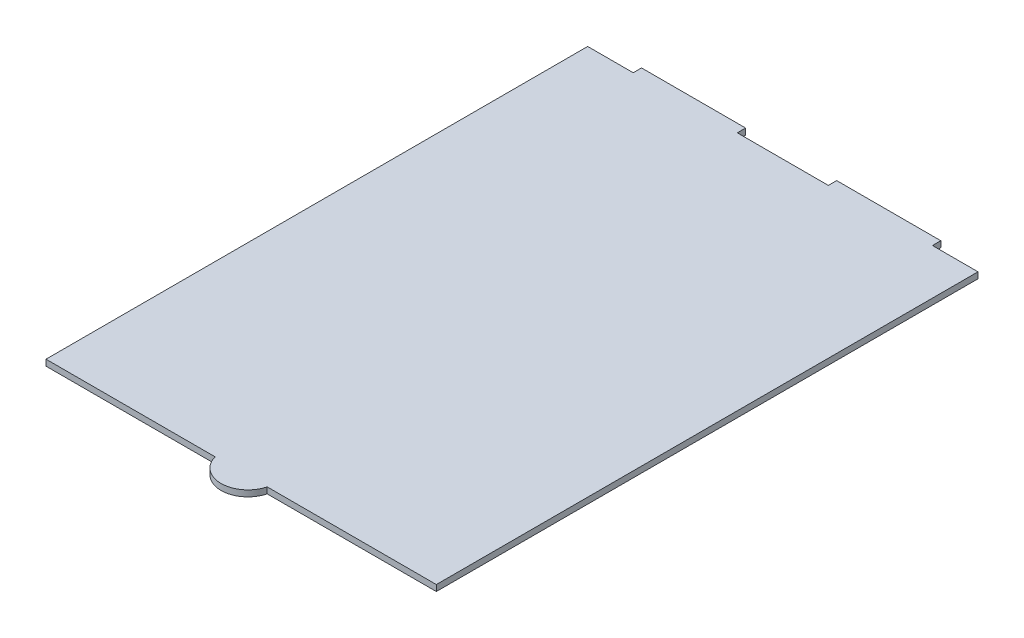
ISO-10303-21;
HEADER;
FILE_DESCRIPTION(('STEP AP214'),'2;1');
FILE_NAME('part.step','',(''),(''),'','','');
FILE_SCHEMA(('AUTOMOTIVE_DESIGN { 1 0 10303 214 1 1 1 1 }'));
ENDSEC;
DATA;
#1=APPLICATION_CONTEXT('core data for automotive mechanical design processes');
#2=APPLICATION_PROTOCOL_DEFINITION('international standard','automotive_design',2000,#1);
#3=PRODUCT_CONTEXT('',#1,'mechanical');
#4=PRODUCT('Part','Part','',(#3));
#5=PRODUCT_RELATED_PRODUCT_CATEGORY('part','',(#4));
#6=PRODUCT_DEFINITION_FORMATION('','',#4);
#7=PRODUCT_DEFINITION_CONTEXT('part definition',#1,'design');
#8=PRODUCT_DEFINITION('design','',#6,#7);
#9=PRODUCT_DEFINITION_SHAPE('','',#8);
#10=(LENGTH_UNIT() NAMED_UNIT(*) SI_UNIT(.MILLI.,.METRE.));
#11=(NAMED_UNIT(*) PLANE_ANGLE_UNIT() SI_UNIT($,.RADIAN.));
#12=(NAMED_UNIT(*) SI_UNIT($,.STERADIAN.) SOLID_ANGLE_UNIT());
#13=UNCERTAINTY_MEASURE_WITH_UNIT(LENGTH_MEASURE(1.E-05),#10,'distance_accuracy_value','');
#14=(GEOMETRIC_REPRESENTATION_CONTEXT(3) GLOBAL_UNCERTAINTY_ASSIGNED_CONTEXT((#13)) GLOBAL_UNIT_ASSIGNED_CONTEXT((#10,
#11,#12)) REPRESENTATION_CONTEXT('',''));
#15=CARTESIAN_POINT('',(0.,0.,0.));
#16=DIRECTION('',(0.,0.,1.));
#17=DIRECTION('',(1.,0.,0.));
#18=AXIS2_PLACEMENT_3D('',#15,#16,#17);
#19=CARTESIAN_POINT('',(1266.82177177283,6.7818,384.048));
#20=DIRECTION('',(0.,0.,1.));
#21=DIRECTION('',(1.,0.,0.));
#22=AXIS2_PLACEMENT_3D('',#19,#20,#21);
#23=PLANE('',#22);
#24=DIRECTION('',(-1.,0.,0.));
#25=VECTOR('',#24,1.);
#26=CARTESIAN_POINT('',(1266.82177177283,3.81,384.048));
#27=LINE('',#26,#25);
#28=CARTESIAN_POINT('',(1289.05,3.81,384.048));
#29=VERTEX_POINT('',#28);
#30=CARTESIAN_POINT('',(1266.82177177283,3.81,384.048));
#31=VERTEX_POINT('',#30);
#32=EDGE_CURVE('E167',#29,#31,#27,.T.);
#33=ORIENTED_EDGE('',*,*,#32,.T.);
#34=DIRECTION('',(0.,-1.,0.));
#35=VECTOR('',#34,1.);
#36=CARTESIAN_POINT('',(1266.82177177283,6.7818,384.048));
#37=LINE('',#36,#35);
#38=CARTESIAN_POINT('',(1266.82177177283,6.7818,384.048));
#39=VERTEX_POINT('',#38);
#40=EDGE_CURVE('E11',#39,#31,#37,.T.);
#41=ORIENTED_EDGE('',*,*,#40,.F.);
#42=DIRECTION('',(-1.,0.,0.));
#43=VECTOR('',#42,1.);
#44=CARTESIAN_POINT('',(1266.82177177283,6.7818,384.048));
#45=LINE('',#44,#43);
#46=CARTESIAN_POINT('',(1289.05,6.7818,384.048));
#47=VERTEX_POINT('',#46);
#48=EDGE_CURVE('E193',#47,#39,#45,.T.);
#49=ORIENTED_EDGE('',*,*,#48,.F.);
#50=DIRECTION('',(0.,-1.,0.));
#51=VECTOR('',#50,1.);
#52=CARTESIAN_POINT('',(1289.05,6.7818,384.048));
#53=LINE('',#52,#51);
#54=EDGE_CURVE('E163',#47,#29,#53,.T.);
#55=ORIENTED_EDGE('',*,*,#54,.T.);
#56=EDGE_LOOP('',(#33,#41,#49,#55));
#57=FACE_BOUND('',#56,.T.);
#58=ADVANCED_FACE('F35',(#57),#23,.F.);
#59=CARTESIAN_POINT('',(1266.82177177283,6.7818,379.984));
#60=DIRECTION('',(-1.,0.,0.));
#61=DIRECTION('',(0.,0.,1.));
#62=AXIS2_PLACEMENT_3D('',#59,#60,#61);
#63=PLANE('',#62);
#64=DIRECTION('',(0.,0.,-1.));
#65=VECTOR('',#64,1.);
#66=CARTESIAN_POINT('',(1266.82177177283,3.81,379.984));
#67=LINE('',#66,#65);
#68=CARTESIAN_POINT('',(1266.82177177283,3.81,379.984));
#69=VERTEX_POINT('',#68);
#70=EDGE_CURVE('E170',#31,#69,#67,.T.);
#71=ORIENTED_EDGE('',*,*,#70,.T.);
#72=DIRECTION('',(0.,-1.,0.));
#73=VECTOR('',#72,1.);
#74=CARTESIAN_POINT('',(1266.82177177283,6.7818,379.984));
#75=LINE('',#74,#73);
#76=CARTESIAN_POINT('',(1266.82177177283,6.7818,379.984));
#77=VERTEX_POINT('',#76);
#78=EDGE_CURVE('E43',#77,#69,#75,.T.);
#79=ORIENTED_EDGE('',*,*,#78,.F.);
#80=DIRECTION('',(0.,0.,-1.));
#81=VECTOR('',#80,1.);
#82=CARTESIAN_POINT('',(1266.82177177283,6.7818,379.984));
#83=LINE('',#82,#81);
#84=EDGE_CURVE('E112',#39,#77,#83,.T.);
#85=ORIENTED_EDGE('',*,*,#84,.F.);
#86=ORIENTED_EDGE('',*,*,#40,.T.);
#87=EDGE_LOOP('',(#71,#79,#85,#86));
#88=FACE_BOUND('',#87,.T.);
#89=ADVANCED_FACE('F281',(#88),#63,.F.);
#90=CARTESIAN_POINT('',(1216.02177177283,6.7818,379.984));
#91=DIRECTION('',(0.,0.,1.));
#92=DIRECTION('',(1.,0.,0.));
#93=AXIS2_PLACEMENT_3D('',#90,#91,#92);
#94=PLANE('',#93);
#95=DIRECTION('',(-1.,0.,0.));
#96=VECTOR('',#95,1.);
#97=CARTESIAN_POINT('',(1216.02177177283,3.81,379.984));
#98=LINE('',#97,#96);
#99=CARTESIAN_POINT('',(1216.02177177283,3.81,379.984));
#100=VERTEX_POINT('',#99);
#101=EDGE_CURVE('E172',#69,#100,#98,.T.);
#102=ORIENTED_EDGE('',*,*,#101,.T.);
#103=DIRECTION('',(0.,-1.,0.));
#104=VECTOR('',#103,1.);
#105=CARTESIAN_POINT('',(1216.02177177283,6.7818,379.984));
#106=LINE('',#105,#104);
#107=CARTESIAN_POINT('',(1216.02177177283,6.7818,379.984));
#108=VERTEX_POINT('',#107);
#109=EDGE_CURVE('E218',#108,#100,#106,.T.);
#110=ORIENTED_EDGE('',*,*,#109,.F.);
#111=DIRECTION('',(-1.,0.,0.));
#112=VECTOR('',#111,1.);
#113=CARTESIAN_POINT('',(1216.02177177283,6.7818,379.984));
#114=LINE('',#113,#112);
#115=EDGE_CURVE('E226',#77,#108,#114,.T.);
#116=ORIENTED_EDGE('',*,*,#115,.F.);
#117=ORIENTED_EDGE('',*,*,#78,.T.);
#118=EDGE_LOOP('',(#102,#110,#116,#117));
#119=FACE_BOUND('',#118,.T.);
#120=ADVANCED_FACE('F224',(#119),#94,.F.);
#121=CARTESIAN_POINT('',(1216.02177177283,6.7818,379.984));
#122=DIRECTION('',(1.,0.,0.));
#123=DIRECTION('',(0.,0.,-1.));
#124=AXIS2_PLACEMENT_3D('',#121,#122,#123);
#125=PLANE('',#124);
#126=DIRECTION('',(0.,0.,1.));
#127=VECTOR('',#126,1.);
#128=CARTESIAN_POINT('',(1216.02177177283,3.81,379.984));
#129=LINE('',#128,#127);
#130=CARTESIAN_POINT('',(1216.02177177283,3.81,384.048));
#131=VERTEX_POINT('',#130);
#132=EDGE_CURVE('E174',#100,#131,#129,.T.);
#133=ORIENTED_EDGE('',*,*,#132,.T.);
#134=DIRECTION('',(0.,-1.,0.));
#135=VECTOR('',#134,1.);
#136=CARTESIAN_POINT('',(1216.02177177283,6.7818,384.048));
#137=LINE('',#136,#135);
#138=CARTESIAN_POINT('',(1216.02177177283,6.7818,384.048));
#139=VERTEX_POINT('',#138);
#140=EDGE_CURVE('E215',#139,#131,#137,.T.);
#141=ORIENTED_EDGE('',*,*,#140,.F.);
#142=DIRECTION('',(0.,0.,1.));
#143=VECTOR('',#142,1.);
#144=CARTESIAN_POINT('',(1216.02177177283,6.7818,379.984));
#145=LINE('',#144,#143);
#146=EDGE_CURVE('E244',#108,#139,#145,.T.);
#147=ORIENTED_EDGE('',*,*,#146,.F.);
#148=ORIENTED_EDGE('',*,*,#109,.T.);
#149=EDGE_LOOP('',(#133,#141,#147,#148));
#150=FACE_BOUND('',#149,.T.);
#151=ADVANCED_FACE('F235',(#150),#125,.F.);
#152=CARTESIAN_POINT('',(1171.57177177283,6.7818,384.048));
#153=DIRECTION('',(0.,0.,1.));
#154=DIRECTION('',(1.,0.,0.));
#155=AXIS2_PLACEMENT_3D('',#152,#153,#154);
#156=PLANE('',#155);
#157=DIRECTION('',(-1.,0.,0.));
#158=VECTOR('',#157,1.);
#159=CARTESIAN_POINT('',(1171.57177177283,3.81,384.048));
#160=LINE('',#159,#158);
#161=CARTESIAN_POINT('',(1171.57177177283,3.81,384.048));
#162=VERTEX_POINT('',#161);
#163=EDGE_CURVE('E176',#131,#162,#160,.T.);
#164=ORIENTED_EDGE('',*,*,#163,.T.);
#165=DIRECTION('',(0.,-1.,0.));
#166=VECTOR('',#165,1.);
#167=CARTESIAN_POINT('',(1171.57177177283,6.7818,384.048));
#168=LINE('',#167,#166);
#169=CARTESIAN_POINT('',(1171.57177177283,6.7818,384.048));
#170=VERTEX_POINT('',#169);
#171=EDGE_CURVE('E212',#170,#162,#168,.T.);
#172=ORIENTED_EDGE('',*,*,#171,.F.);
#173=DIRECTION('',(-1.,0.,0.));
#174=VECTOR('',#173,1.);
#175=CARTESIAN_POINT('',(1171.57177177283,6.7818,384.048));
#176=LINE('',#175,#174);
#177=EDGE_CURVE('E241',#139,#170,#176,.T.);
#178=ORIENTED_EDGE('',*,*,#177,.F.);
#179=ORIENTED_EDGE('',*,*,#140,.T.);
#180=EDGE_LOOP('',(#164,#172,#178,#179));
#181=FACE_BOUND('',#180,.T.);
#182=ADVANCED_FACE('F239',(#181),#156,.F.);
#183=CARTESIAN_POINT('',(1171.57177177283,6.7818,379.984));
#184=DIRECTION('',(-1.,0.,0.));
#185=DIRECTION('',(0.,0.,1.));
#186=AXIS2_PLACEMENT_3D('',#183,#184,#185);
#187=PLANE('',#186);
#188=DIRECTION('',(0.,0.,-1.));
#189=VECTOR('',#188,1.);
#190=CARTESIAN_POINT('',(1171.57177177283,3.81,379.984));
#191=LINE('',#190,#189);
#192=CARTESIAN_POINT('',(1171.57177177283,3.81,379.984));
#193=VERTEX_POINT('',#192);
#194=EDGE_CURVE('E178',#162,#193,#191,.T.);
#195=ORIENTED_EDGE('',*,*,#194,.T.);
#196=DIRECTION('',(0.,-1.,0.));
#197=VECTOR('',#196,1.);
#198=CARTESIAN_POINT('',(1171.57177177283,6.7818,379.984));
#199=LINE('',#198,#197);
#200=CARTESIAN_POINT('',(1171.57177177283,6.7818,379.984));
#201=VERTEX_POINT('',#200);
#202=EDGE_CURVE('E209',#201,#193,#199,.T.);
#203=ORIENTED_EDGE('',*,*,#202,.F.);
#204=DIRECTION('',(0.,0.,-1.));
#205=VECTOR('',#204,1.);
#206=CARTESIAN_POINT('',(1171.57177177283,6.7818,379.984));
#207=LINE('',#206,#205);
#208=EDGE_CURVE('E243',#170,#201,#207,.T.);
#209=ORIENTED_EDGE('',*,*,#208,.F.);
#210=ORIENTED_EDGE('',*,*,#171,.T.);
#211=EDGE_LOOP('',(#195,#203,#209,#210));
#212=FACE_BOUND('',#211,.T.);
#213=ADVANCED_FACE('F294',(#212),#187,.F.);
#214=CARTESIAN_POINT('',(1120.77177177283,6.7818,379.984));
#215=DIRECTION('',(0.,0.,1.));
#216=DIRECTION('',(1.,0.,0.));
#217=AXIS2_PLACEMENT_3D('',#214,#215,#216);
#218=PLANE('',#217);
#219=DIRECTION('',(-1.,0.,0.));
#220=VECTOR('',#219,1.);
#221=CARTESIAN_POINT('',(1120.77177177283,3.81,379.984));
#222=LINE('',#221,#220);
#223=CARTESIAN_POINT('',(1120.77177177283,3.81,379.984));
#224=VERTEX_POINT('',#223);
#225=EDGE_CURVE('E180',#193,#224,#222,.T.);
#226=ORIENTED_EDGE('',*,*,#225,.T.);
#227=DIRECTION('',(0.,-1.,0.));
#228=VECTOR('',#227,1.);
#229=CARTESIAN_POINT('',(1120.77177177283,6.7818,379.984));
#230=LINE('',#229,#228);
#231=CARTESIAN_POINT('',(1120.77177177283,6.7818,379.984));
#232=VERTEX_POINT('',#231);
#233=EDGE_CURVE('E206',#232,#224,#230,.T.);
#234=ORIENTED_EDGE('',*,*,#233,.F.);
#235=DIRECTION('',(-1.,0.,0.));
#236=VECTOR('',#235,1.);
#237=CARTESIAN_POINT('',(1120.77177177283,6.7818,379.984));
#238=LINE('',#237,#236);
#239=EDGE_CURVE('E246',#201,#232,#238,.T.);
#240=ORIENTED_EDGE('',*,*,#239,.F.);
#241=ORIENTED_EDGE('',*,*,#202,.T.);
#242=EDGE_LOOP('',(#226,#234,#240,#241));
#243=FACE_BOUND('',#242,.T.);
#244=ADVANCED_FACE('F297',(#243),#218,.F.);
#245=CARTESIAN_POINT('',(1120.77177177283,6.7818,379.984));
#246=DIRECTION('',(1.,0.,0.));
#247=DIRECTION('',(0.,0.,-1.));
#248=AXIS2_PLACEMENT_3D('',#245,#246,#247);
#249=PLANE('',#248);
#250=DIRECTION('',(0.,0.,1.));
#251=VECTOR('',#250,1.);
#252=CARTESIAN_POINT('',(1120.77177177283,3.81,379.984));
#253=LINE('',#252,#251);
#254=CARTESIAN_POINT('',(1120.77177177283,3.81,384.048));
#255=VERTEX_POINT('',#254);
#256=EDGE_CURVE('E182',#224,#255,#253,.T.);
#257=ORIENTED_EDGE('',*,*,#256,.T.);
#258=DIRECTION('',(0.,-1.,0.));
#259=VECTOR('',#258,1.);
#260=CARTESIAN_POINT('',(1120.77177177283,6.7818,384.048));
#261=LINE('',#260,#259);
#262=CARTESIAN_POINT('',(1120.77177177283,6.7818,384.048));
#263=VERTEX_POINT('',#262);
#264=EDGE_CURVE('E203',#263,#255,#261,.T.);
#265=ORIENTED_EDGE('',*,*,#264,.F.);
#266=DIRECTION('',(0.,0.,1.));
#267=VECTOR('',#266,1.);
#268=CARTESIAN_POINT('',(1120.77177177283,6.7818,379.984));
#269=LINE('',#268,#267);
#270=EDGE_CURVE('E252',#232,#263,#269,.T.);
#271=ORIENTED_EDGE('',*,*,#270,.F.);
#272=ORIENTED_EDGE('',*,*,#233,.T.);
#273=EDGE_LOOP('',(#257,#265,#271,#272));
#274=FACE_BOUND('',#273,.T.);
#275=ADVANCED_FACE('F301',(#274),#249,.F.);
#276=CARTESIAN_POINT('',(1098.55,6.7818,384.048));
#277=DIRECTION('',(0.,0.,1.));
#278=DIRECTION('',(1.,0.,0.));
#279=AXIS2_PLACEMENT_3D('',#276,#277,#278);
#280=PLANE('',#279);
#281=DIRECTION('',(-1.,0.,0.));
#282=VECTOR('',#281,1.);
#283=CARTESIAN_POINT('',(1098.55,3.81,384.048));
#284=LINE('',#283,#282);
#285=CARTESIAN_POINT('',(1098.55,3.81,384.048));
#286=VERTEX_POINT('',#285);
#287=EDGE_CURVE('E184',#255,#286,#284,.T.);
#288=ORIENTED_EDGE('',*,*,#287,.T.);
#289=DIRECTION('',(0.,-1.,0.));
#290=VECTOR('',#289,1.);
#291=CARTESIAN_POINT('',(1098.55,6.7818,384.048));
#292=LINE('',#291,#290);
#293=CARTESIAN_POINT('',(1098.55,6.7818,384.048));
#294=VERTEX_POINT('',#293);
#295=EDGE_CURVE('E200',#294,#286,#292,.T.);
#296=ORIENTED_EDGE('',*,*,#295,.F.);
#297=DIRECTION('',(-1.,0.,0.));
#298=VECTOR('',#297,1.);
#299=CARTESIAN_POINT('',(1098.55,6.7818,384.048));
#300=LINE('',#299,#298);
#301=EDGE_CURVE('E254',#263,#294,#300,.T.);
#302=ORIENTED_EDGE('',*,*,#301,.F.);
#303=ORIENTED_EDGE('',*,*,#264,.T.);
#304=EDGE_LOOP('',(#288,#296,#302,#303));
#305=FACE_BOUND('',#304,.T.);
#306=ADVANCED_FACE('F305',(#305),#280,.F.);
#307=CARTESIAN_POINT('',(1098.55,6.7818,384.048));
#308=DIRECTION('',(1.,0.,0.));
#309=DIRECTION('',(0.,0.,-1.));
#310=AXIS2_PLACEMENT_3D('',#307,#308,#309);
#311=PLANE('',#310);
#312=DIRECTION('',(0.,0.,1.));
#313=VECTOR('',#312,1.);
#314=CARTESIAN_POINT('',(1098.55,3.81,384.048));
#315=LINE('',#314,#313);
#316=CARTESIAN_POINT('',(1098.55,3.81,648.4112));
#317=VERTEX_POINT('',#316);
#318=EDGE_CURVE('E186',#286,#317,#315,.T.);
#319=ORIENTED_EDGE('',*,*,#318,.T.);
#320=DIRECTION('',(0.,-1.,0.));
#321=VECTOR('',#320,1.);
#322=CARTESIAN_POINT('',(1098.55,6.7818,648.4112));
#323=LINE('',#322,#321);
#324=CARTESIAN_POINT('',(1098.55,6.7818,648.4112));
#325=VERTEX_POINT('',#324);
#326=EDGE_CURVE('E197',#325,#317,#323,.T.);
#327=ORIENTED_EDGE('',*,*,#326,.F.);
#328=DIRECTION('',(0.,0.,1.));
#329=VECTOR('',#328,1.);
#330=CARTESIAN_POINT('',(1098.55,6.7818,384.048));
#331=LINE('',#330,#329);
#332=EDGE_CURVE('E256',#294,#325,#331,.T.);
#333=ORIENTED_EDGE('',*,*,#332,.F.);
#334=ORIENTED_EDGE('',*,*,#295,.T.);
#335=EDGE_LOOP('',(#319,#327,#333,#334));
#336=FACE_BOUND('',#335,.T.);
#337=ADVANCED_FACE('F262',(#336),#311,.F.);
#338=CARTESIAN_POINT('',(1098.55,6.7818,648.4112));
#339=DIRECTION('',(0.,0.,-1.));
#340=DIRECTION('',(-1.,0.,0.));
#341=AXIS2_PLACEMENT_3D('',#338,#339,#340);
#342=PLANE('',#341);
#343=DIRECTION('',(1.,0.,0.));
#344=VECTOR('',#343,1.);
#345=CARTESIAN_POINT('',(1098.55,3.81,648.4112));
#346=LINE('',#345,#344);
#347=CARTESIAN_POINT('',(1181.1,3.81,648.4112));
#348=VERTEX_POINT('',#347);
#349=EDGE_CURVE('E188',#317,#348,#346,.T.);
#350=ORIENTED_EDGE('',*,*,#349,.T.);
#351=DIRECTION('',(0.,-1.,0.));
#352=VECTOR('',#351,1.);
#353=CARTESIAN_POINT('',(1181.1,6.7818,648.4112));
#354=LINE('',#353,#352);
#355=CARTESIAN_POINT('',(1181.1,6.7818,648.4112));
#356=VERTEX_POINT('',#355);
#357=EDGE_CURVE('E158',#356,#348,#354,.T.);
#358=ORIENTED_EDGE('',*,*,#357,.F.);
#359=DIRECTION('',(1.,0.,0.));
#360=VECTOR('',#359,1.);
#361=CARTESIAN_POINT('',(1098.55,6.7818,648.4112));
#362=LINE('',#361,#360);
#363=EDGE_CURVE('E149',#325,#356,#362,.T.);
#364=ORIENTED_EDGE('',*,*,#363,.F.);
#365=ORIENTED_EDGE('',*,*,#326,.T.);
#366=EDGE_LOOP('',(#350,#358,#364,#365));
#367=FACE_BOUND('',#366,.T.);
#368=ADVANCED_FACE('F266',(#367),#342,.F.);
#369=CARTESIAN_POINT('',(1193.8,6.7818,645.120175749798));
#370=DIRECTION('',(0.,-1.,0.));
#371=DIRECTION('',(0.,0.,-1.));
#372=AXIS2_PLACEMENT_3D('',#369,#370,#371);
#373=CYLINDRICAL_SURFACE('',#372,13.1194832449842);
#374=CARTESIAN_POINT('',(1193.8,3.81,645.120175749798));
#375=DIRECTION('',(0.,1.,0.));
#376=DIRECTION('',(0.,0.,1.));
#377=AXIS2_PLACEMENT_3D('',#374,#375,#376);
#378=CIRCLE('',#377,13.1194832449842);
#379=CARTESIAN_POINT('',(1206.5,3.81,648.4112));
#380=VERTEX_POINT('',#379);
#381=EDGE_CURVE('E157',#348,#380,#378,.T.);
#382=ORIENTED_EDGE('',*,*,#381,.T.);
#383=DIRECTION('',(0.,-1.,0.));
#384=VECTOR('',#383,1.);
#385=CARTESIAN_POINT('',(1206.5,6.7818,648.4112));
#386=LINE('',#385,#384);
#387=CARTESIAN_POINT('',(1206.5,6.7818,648.4112));
#388=VERTEX_POINT('',#387);
#389=EDGE_CURVE('E154',#388,#380,#386,.T.);
#390=ORIENTED_EDGE('',*,*,#389,.F.);
#391=CARTESIAN_POINT('',(1193.8,6.7818,645.120175749798));
#392=DIRECTION('',(0.,1.,0.));
#393=DIRECTION('',(0.,0.,1.));
#394=AXIS2_PLACEMENT_3D('',#391,#392,#393);
#395=CIRCLE('',#394,13.1194832449842);
#396=EDGE_CURVE('E143',#356,#388,#395,.T.);
#397=ORIENTED_EDGE('',*,*,#396,.F.);
#398=ORIENTED_EDGE('',*,*,#357,.T.);
#399=EDGE_LOOP('',(#382,#390,#397,#398));
#400=FACE_BOUND('',#399,.T.);
#401=ADVANCED_FACE('F155',(#400),#373,.T.);
#402=CARTESIAN_POINT('',(1206.5,6.7818,648.4112));
#403=DIRECTION('',(0.,0.,-1.));
#404=DIRECTION('',(-1.,0.,0.));
#405=AXIS2_PLACEMENT_3D('',#402,#403,#404);
#406=PLANE('',#405);
#407=DIRECTION('',(1.,0.,0.));
#408=VECTOR('',#407,1.);
#409=CARTESIAN_POINT('',(1206.5,3.81,648.4112));
#410=LINE('',#409,#408);
#411=CARTESIAN_POINT('',(1289.05,3.81,648.4112));
#412=VERTEX_POINT('',#411);
#413=EDGE_CURVE('E98',#380,#412,#410,.T.);
#414=ORIENTED_EDGE('',*,*,#413,.T.);
#415=DIRECTION('',(0.,-1.,0.));
#416=VECTOR('',#415,1.);
#417=CARTESIAN_POINT('',(1289.05,6.7818,648.4112));
#418=LINE('',#417,#416);
#419=CARTESIAN_POINT('',(1289.05,6.7818,648.4112));
#420=VERTEX_POINT('',#419);
#421=EDGE_CURVE('E159',#420,#412,#418,.T.);
#422=ORIENTED_EDGE('',*,*,#421,.F.);
#423=DIRECTION('',(1.,0.,0.));
#424=VECTOR('',#423,1.);
#425=CARTESIAN_POINT('',(1206.5,6.7818,648.4112));
#426=LINE('',#425,#424);
#427=EDGE_CURVE('E147',#388,#420,#426,.T.);
#428=ORIENTED_EDGE('',*,*,#427,.F.);
#429=ORIENTED_EDGE('',*,*,#389,.T.);
#430=EDGE_LOOP('',(#414,#422,#428,#429));
#431=FACE_BOUND('',#430,.T.);
#432=ADVANCED_FACE('F161',(#431),#406,.F.);
#433=CARTESIAN_POINT('',(1289.05,6.7818,384.048));
#434=DIRECTION('',(-1.,0.,0.));
#435=DIRECTION('',(0.,0.,1.));
#436=AXIS2_PLACEMENT_3D('',#433,#434,#435);
#437=PLANE('',#436);
#438=DIRECTION('',(0.,0.,-1.));
#439=VECTOR('',#438,1.);
#440=CARTESIAN_POINT('',(1289.05,3.81,384.048));
#441=LINE('',#440,#439);
#442=EDGE_CURVE('E104',#412,#29,#441,.T.);
#443=ORIENTED_EDGE('',*,*,#442,.T.);
#444=ORIENTED_EDGE('',*,*,#54,.F.);
#445=DIRECTION('',(0.,0.,-1.));
#446=VECTOR('',#445,1.);
#447=CARTESIAN_POINT('',(1289.05,6.7818,384.048));
#448=LINE('',#447,#446);
#449=EDGE_CURVE('E51',#420,#47,#448,.T.);
#450=ORIENTED_EDGE('',*,*,#449,.F.);
#451=ORIENTED_EDGE('',*,*,#421,.T.);
#452=EDGE_LOOP('',(#443,#444,#450,#451));
#453=FACE_BOUND('',#452,.T.);
#454=ADVANCED_FACE('F270',(#453),#437,.F.);
#455=CARTESIAN_POINT('',(1193.8,6.7818,645.120175749798));
#456=DIRECTION('',(0.,1.,0.));
#457=DIRECTION('',(0.,0.,1.));
#458=AXIS2_PLACEMENT_3D('',#455,#456,#457);
#459=PLANE('',#458);
#460=ORIENTED_EDGE('',*,*,#48,.T.);
#461=ORIENTED_EDGE('',*,*,#84,.T.);
#462=ORIENTED_EDGE('',*,*,#115,.T.);
#463=ORIENTED_EDGE('',*,*,#146,.T.);
#464=ORIENTED_EDGE('',*,*,#177,.T.);
#465=ORIENTED_EDGE('',*,*,#208,.T.);
#466=ORIENTED_EDGE('',*,*,#239,.T.);
#467=ORIENTED_EDGE('',*,*,#270,.T.);
#468=ORIENTED_EDGE('',*,*,#301,.T.);
#469=ORIENTED_EDGE('',*,*,#332,.T.);
#470=ORIENTED_EDGE('',*,*,#363,.T.);
#471=ORIENTED_EDGE('',*,*,#396,.T.);
#472=ORIENTED_EDGE('',*,*,#427,.T.);
#473=ORIENTED_EDGE('',*,*,#449,.T.);
#474=EDGE_LOOP('',(#460,#461,#462,#463,#464,#465,#466,#467,#468,#469,#470,#471,#472,#473));
#475=FACE_BOUND('',#474,.T.);
#476=ADVANCED_FACE('F145',(#475),#459,.T.);
#477=CARTESIAN_POINT('',(1193.8,3.81,645.120175749798));
#478=DIRECTION('',(0.,1.,0.));
#479=DIRECTION('',(0.,0.,1.));
#480=AXIS2_PLACEMENT_3D('',#477,#478,#479);
#481=PLANE('',#480);
#482=ORIENTED_EDGE('',*,*,#32,.F.);
#483=ORIENTED_EDGE('',*,*,#442,.F.);
#484=ORIENTED_EDGE('',*,*,#413,.F.);
#485=ORIENTED_EDGE('',*,*,#381,.F.);
#486=ORIENTED_EDGE('',*,*,#349,.F.);
#487=ORIENTED_EDGE('',*,*,#318,.F.);
#488=ORIENTED_EDGE('',*,*,#287,.F.);
#489=ORIENTED_EDGE('',*,*,#256,.F.);
#490=ORIENTED_EDGE('',*,*,#225,.F.);
#491=ORIENTED_EDGE('',*,*,#194,.F.);
#492=ORIENTED_EDGE('',*,*,#163,.F.);
#493=ORIENTED_EDGE('',*,*,#132,.F.);
#494=ORIENTED_EDGE('',*,*,#101,.F.);
#495=ORIENTED_EDGE('',*,*,#70,.F.);
#496=EDGE_LOOP('',(#482,#483,#484,#485,#486,#487,#488,#489,#490,#491,#492,#493,#494,#495));
#497=FACE_BOUND('',#496,.T.);
#498=ADVANCED_FACE('F230',(#497),#481,.F.);
#499=CLOSED_SHELL('',(#58,#89,#120,#151,#182,#213,#244,#275,#306,#337,#368,#401,#432,#454,#476,#498));
#500=MANIFOLD_SOLID_BREP('B2',#499);
#501=ADVANCED_BREP_SHAPE_REPRESENTATION('',(#18,#500),#14);
#502=SHAPE_DEFINITION_REPRESENTATION(#9,#501);
ENDSEC;
END-ISO-10303-21;
